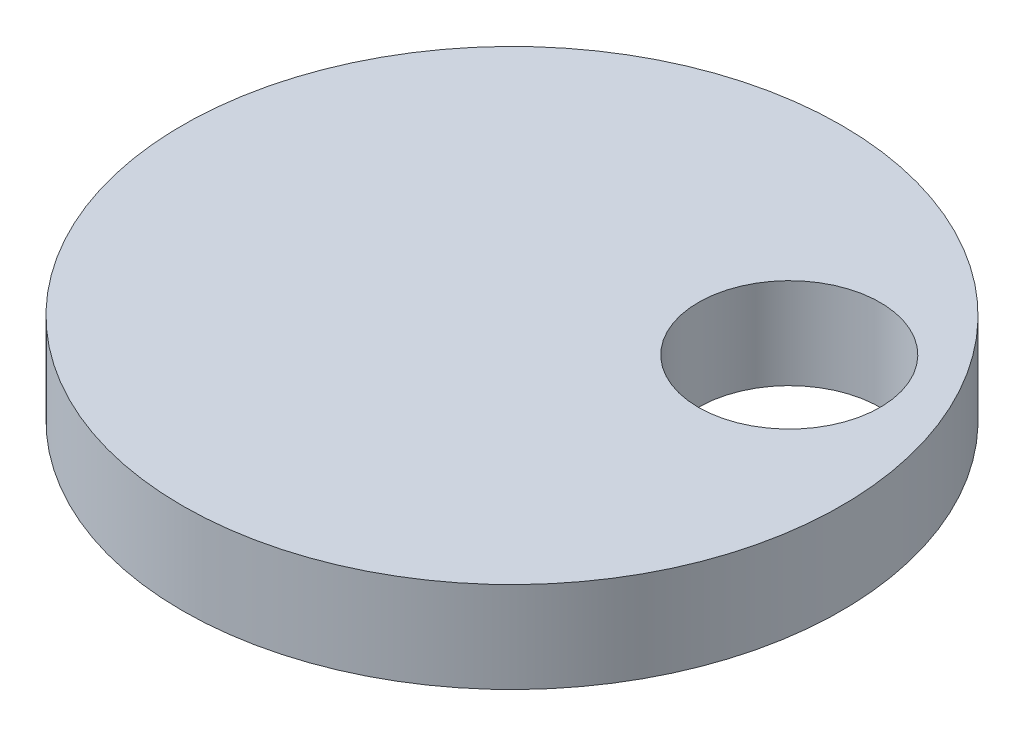
ISO-10303-21;
HEADER;
FILE_DESCRIPTION(('STEP AP214'),'2;1');
FILE_NAME('part.step','',(''),(''),'','','');
FILE_SCHEMA(('AUTOMOTIVE_DESIGN { 1 0 10303 214 1 1 1 1 }'));
ENDSEC;
DATA;
#1=APPLICATION_CONTEXT('core data for automotive mechanical design processes');
#2=APPLICATION_PROTOCOL_DEFINITION('international standard','automotive_design',2000,#1);
#3=PRODUCT_CONTEXT('',#1,'mechanical');
#4=PRODUCT('Part','Part','',(#3));
#5=PRODUCT_RELATED_PRODUCT_CATEGORY('part','',(#4));
#6=PRODUCT_DEFINITION_FORMATION('','',#4);
#7=PRODUCT_DEFINITION_CONTEXT('part definition',#1,'design');
#8=PRODUCT_DEFINITION('design','',#6,#7);
#9=PRODUCT_DEFINITION_SHAPE('','',#8);
#10=(LENGTH_UNIT() NAMED_UNIT(*) SI_UNIT(.MILLI.,.METRE.));
#11=(NAMED_UNIT(*) PLANE_ANGLE_UNIT() SI_UNIT($,.RADIAN.));
#12=(NAMED_UNIT(*) SI_UNIT($,.STERADIAN.) SOLID_ANGLE_UNIT());
#13=UNCERTAINTY_MEASURE_WITH_UNIT(LENGTH_MEASURE(1.E-05),#10,'distance_accuracy_value','');
#14=(GEOMETRIC_REPRESENTATION_CONTEXT(3) GLOBAL_UNCERTAINTY_ASSIGNED_CONTEXT((#13)) GLOBAL_UNIT_ASSIGNED_CONTEXT((#10,
#11,#12)) REPRESENTATION_CONTEXT('',''));
#15=CARTESIAN_POINT('',(0.,0.,0.));
#16=DIRECTION('',(0.,0.,1.));
#17=DIRECTION('',(1.,0.,0.));
#18=AXIS2_PLACEMENT_3D('',#15,#16,#17);
#19=CARTESIAN_POINT('',(0.,25.4,0.));
#20=DIRECTION('',(0.,-1.,0.));
#21=DIRECTION('',(0.,0.,-1.));
#22=AXIS2_PLACEMENT_3D('',#19,#20,#21);
#23=CYLINDRICAL_SURFACE('',#22,92.075);
#24=CARTESIAN_POINT('',(0.,25.4,0.));
#25=DIRECTION('',(0.,1.,0.));
#26=DIRECTION('',(0.,0.,1.));
#27=AXIS2_PLACEMENT_3D('',#24,#25,#26);
#28=CIRCLE('',#27,92.075);
#29=CARTESIAN_POINT('',(0.,25.4,92.075));
#30=VERTEX_POINT('',#29);
#31=EDGE_CURVE('E10',#30,#30,#28,.T.);
#32=ORIENTED_EDGE('',*,*,#31,.F.);
#33=EDGE_LOOP('',(#32));
#34=FACE_BOUND('',#33,.T.);
#35=CARTESIAN_POINT('',(0.,0.,0.));
#36=DIRECTION('',(0.,1.,0.));
#37=DIRECTION('',(0.,0.,1.));
#38=AXIS2_PLACEMENT_3D('',#35,#36,#37);
#39=CIRCLE('',#38,92.075);
#40=CARTESIAN_POINT('',(0.,0.,92.075));
#41=VERTEX_POINT('',#40);
#42=EDGE_CURVE('E35',#41,#41,#39,.T.);
#43=ORIENTED_EDGE('',*,*,#42,.T.);
#44=EDGE_LOOP('',(#43));
#45=FACE_BOUND('',#44,.T.);
#46=ADVANCED_FACE('F32',(#34,#45),#23,.T.);
#47=CARTESIAN_POINT('',(0.,25.4,0.));
#48=DIRECTION('',(0.,1.,0.));
#49=DIRECTION('',(0.,0.,1.));
#50=AXIS2_PLACEMENT_3D('',#47,#48,#49);
#51=PLANE('',#50);
#52=CARTESIAN_POINT('',(48.26,25.4,-29.21));
#53=DIRECTION('',(0.,1.,0.));
#54=DIRECTION('',(0.,0.,1.));
#55=AXIS2_PLACEMENT_3D('',#52,#53,#54);
#56=CIRCLE('',#55,25.4);
#57=CARTESIAN_POINT('',(48.26,25.4,-3.80999999999999));
#58=VERTEX_POINT('',#57);
#59=EDGE_CURVE('E46',#58,#58,#56,.T.);
#60=ORIENTED_EDGE('',*,*,#59,.F.);
#61=EDGE_LOOP('',(#60));
#62=FACE_BOUND('',#61,.T.);
#63=ORIENTED_EDGE('',*,*,#31,.T.);
#64=EDGE_LOOP('',(#63));
#65=FACE_BOUND('',#64,.T.);
#66=ADVANCED_FACE('F52',(#62,#65),#51,.T.);
#67=CARTESIAN_POINT('',(0.,0.,0.));
#68=DIRECTION('',(0.,1.,0.));
#69=DIRECTION('',(0.,0.,1.));
#70=AXIS2_PLACEMENT_3D('',#67,#68,#69);
#71=PLANE('',#70);
#72=CARTESIAN_POINT('',(48.26,0.,-29.21));
#73=DIRECTION('',(0.,1.,0.));
#74=DIRECTION('',(0.,0.,1.));
#75=AXIS2_PLACEMENT_3D('',#72,#73,#74);
#76=CIRCLE('',#75,25.4);
#77=CARTESIAN_POINT('',(48.26,0.,-3.80999999999999));
#78=VERTEX_POINT('',#77);
#79=EDGE_CURVE('E42',#78,#78,#76,.F.);
#80=ORIENTED_EDGE('',*,*,#79,.F.);
#81=EDGE_LOOP('',(#80));
#82=FACE_BOUND('',#81,.T.);
#83=ORIENTED_EDGE('',*,*,#42,.F.);
#84=EDGE_LOOP('',(#83));
#85=FACE_BOUND('',#84,.T.);
#86=ADVANCED_FACE('F54',(#82,#85),#71,.F.);
#87=CARTESIAN_POINT('',(48.26,-71.8420489685533,-29.21));
#88=DIRECTION('',(0.,1.,0.));
#89=DIRECTION('',(0.,0.,1.));
#90=AXIS2_PLACEMENT_3D('',#87,#88,#89);
#91=CYLINDRICAL_SURFACE('',#90,25.4);
#92=ORIENTED_EDGE('',*,*,#79,.T.);
#93=EDGE_LOOP('',(#92));
#94=FACE_BOUND('',#93,.T.);
#95=ORIENTED_EDGE('',*,*,#59,.T.);
#96=EDGE_LOOP('',(#95));
#97=FACE_BOUND('',#96,.T.);
#98=ADVANCED_FACE('F50',(#94,#97),#91,.F.);
#99=CLOSED_SHELL('',(#46,#66,#86,#98));
#100=MANIFOLD_SOLID_BREP('B2',#99);
#101=ADVANCED_BREP_SHAPE_REPRESENTATION('',(#18,#100),#14);
#102=SHAPE_DEFINITION_REPRESENTATION(#9,#101);
ENDSEC;
END-ISO-10303-21;
